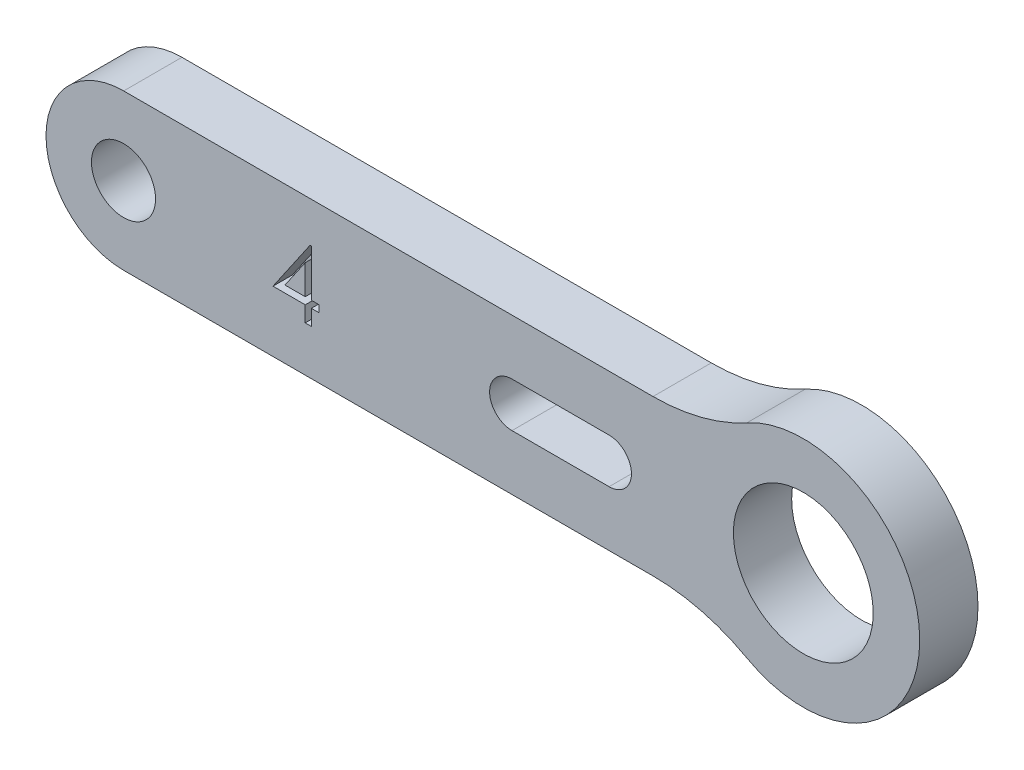
ISO-10303-21;
HEADER;
FILE_DESCRIPTION(('STEP AP214'),'2;1');
FILE_NAME('part.step','',(''),(''),'','','');
FILE_SCHEMA(('AUTOMOTIVE_DESIGN { 1 0 10303 214 1 1 1 1 }'));
ENDSEC;
DATA;
#1=APPLICATION_CONTEXT('core data for automotive mechanical design processes');
#2=APPLICATION_PROTOCOL_DEFINITION('international standard','automotive_design',2000,#1);
#3=PRODUCT_CONTEXT('',#1,'mechanical');
#4=PRODUCT('Part','Part','',(#3));
#5=PRODUCT_RELATED_PRODUCT_CATEGORY('part','',(#4));
#6=PRODUCT_DEFINITION_FORMATION('','',#4);
#7=PRODUCT_DEFINITION_CONTEXT('part definition',#1,'design');
#8=PRODUCT_DEFINITION('design','',#6,#7);
#9=PRODUCT_DEFINITION_SHAPE('','',#8);
#10=(LENGTH_UNIT() NAMED_UNIT(*) SI_UNIT(.MILLI.,.METRE.));
#11=(NAMED_UNIT(*) PLANE_ANGLE_UNIT() SI_UNIT($,.RADIAN.));
#12=(NAMED_UNIT(*) SI_UNIT($,.STERADIAN.) SOLID_ANGLE_UNIT());
#13=UNCERTAINTY_MEASURE_WITH_UNIT(LENGTH_MEASURE(1.E-05),#10,'distance_accuracy_value','');
#14=(GEOMETRIC_REPRESENTATION_CONTEXT(3) GLOBAL_UNCERTAINTY_ASSIGNED_CONTEXT((#13)) GLOBAL_UNIT_ASSIGNED_CONTEXT((#10,
#11,#12)) REPRESENTATION_CONTEXT('',''));
#15=CARTESIAN_POINT('',(0.,0.,0.));
#16=DIRECTION('',(0.,0.,1.));
#17=DIRECTION('',(1.,0.,0.));
#18=AXIS2_PLACEMENT_3D('',#15,#16,#17);
#19=CARTESIAN_POINT('',(23.3783422515076,4.00149259352111,3.));
#20=DIRECTION('',(0.,0.,1.));
#21=DIRECTION('',(1.,0.,0.));
#22=AXIS2_PLACEMENT_3D('',#19,#20,#21);
#23=PLANE('',#22);
#24=CARTESIAN_POINT('',(23.3783422515076,4.00149259352111,3.));
#25=DIRECTION('',(0.,0.,1.));
#26=DIRECTION('',(1.,0.,0.));
#27=AXIS2_PLACEMENT_3D('',#24,#25,#26);
#28=CIRCLE('',#27,5.99460570350379);
#29=CARTESIAN_POINT('',(20.4804285975604,-1.24611581362462,3.));
#30=VERTEX_POINT('',#29);
#31=CARTESIAN_POINT('',(20.4784035436222,9.24798218476098,3.));
#32=VERTEX_POINT('',#31);
#33=EDGE_CURVE('E340',#30,#32,#28,.T.);
#34=ORIENTED_EDGE('',*,*,#33,.T.);
#35=CARTESIAN_POINT('',(15.6408231399763,18.,3.));
#36=DIRECTION('',(0.,0.,-1.));
#37=DIRECTION('',(-1.,0.,0.));
#38=AXIS2_PLACEMENT_3D('',#35,#36,#37);
#39=CIRCLE('',#38,10.);
#40=CARTESIAN_POINT('',(15.6408231399763,8.,3.));
#41=VERTEX_POINT('',#40);
#42=EDGE_CURVE('E364',#32,#41,#39,.T.);
#43=ORIENTED_EDGE('',*,*,#42,.T.);
#44=DIRECTION('',(-1.,0.,0.));
#45=VECTOR('',#44,1.);
#46=CARTESIAN_POINT('',(15.6408231399763,8.,3.));
#47=LINE('',#46,#45);
#48=CARTESIAN_POINT('',(-11.6110208815812,8.,3.));
#49=VERTEX_POINT('',#48);
#50=EDGE_CURVE('E367',#41,#49,#47,.T.);
#51=ORIENTED_EDGE('',*,*,#50,.T.);
#52=CARTESIAN_POINT('',(-11.6110208815812,4.,3.));
#53=DIRECTION('',(0.,0.,1.));
#54=DIRECTION('',(1.,0.,0.));
#55=AXIS2_PLACEMENT_3D('',#52,#53,#54);
#56=CIRCLE('',#55,4.);
#57=CARTESIAN_POINT('',(-11.6110208815812,0.,3.));
#58=VERTEX_POINT('',#57);
#59=EDGE_CURVE('E370',#49,#58,#56,.T.);
#60=ORIENTED_EDGE('',*,*,#59,.T.);
#61=DIRECTION('',(1.,0.,0.));
#62=VECTOR('',#61,1.);
#63=CARTESIAN_POINT('',(-11.6110208815812,0.,3.));
#64=LINE('',#63,#62);
#65=CARTESIAN_POINT('',(15.6462263209147,0.,3.));
#66=VERTEX_POINT('',#65);
#67=EDGE_CURVE('E373',#58,#66,#64,.T.);
#68=ORIENTED_EDGE('',*,*,#67,.T.);
#69=CARTESIAN_POINT('',(15.6462263209147,-10.,3.));
#70=DIRECTION('',(0.,0.,-1.));
#71=DIRECTION('',(-1.,0.,0.));
#72=AXIS2_PLACEMENT_3D('',#69,#70,#71);
#73=CIRCLE('',#72,9.99999999999999);
#74=EDGE_CURVE('E347',#66,#30,#73,.T.);
#75=ORIENTED_EDGE('',*,*,#74,.T.);
#76=EDGE_LOOP('',(#34,#43,#51,#60,#68,#75));
#77=FACE_BOUND('',#76,.T.);
#78=CARTESIAN_POINT('',(-11.6193859771087,4.00018272906783,3.));
#79=DIRECTION('',(0.,0.,1.));
#80=DIRECTION('',(-1.,0.,0.));
#81=AXIS2_PLACEMENT_3D('',#78,#79,#80);
#82=CIRCLE('',#81,1.65);
#83=CARTESIAN_POINT('',(-13.2693859771087,4.00018272906783,3.));
#84=VERTEX_POINT('',#83);
#85=EDGE_CURVE('E334',#84,#84,#82,.T.);
#86=ORIENTED_EDGE('',*,*,#85,.F.);
#87=EDGE_LOOP('',(#86));
#88=FACE_BOUND('',#87,.T.);
#89=CARTESIAN_POINT('',(23.3793348450287,4.00050000000005,3.));
#90=DIRECTION('',(0.,0.,1.));
#91=DIRECTION('',(-1.,0.,0.));
#92=AXIS2_PLACEMENT_3D('',#89,#90,#91);
#93=CIRCLE('',#92,3.6);
#94=CARTESIAN_POINT('',(19.7793348450287,4.00050000000005,3.));
#95=VERTEX_POINT('',#94);
#96=EDGE_CURVE('E324',#95,#95,#93,.T.);
#97=ORIENTED_EDGE('',*,*,#96,.F.);
#98=EDGE_LOOP('',(#97));
#99=FACE_BOUND('',#98,.T.);
#100=CARTESIAN_POINT('',(13.3803806473393,4.00026662444805,3.));
#101=DIRECTION('',(0.,0.,1.));
#102=DIRECTION('',(-1.,0.,0.));
#103=AXIS2_PLACEMENT_3D('',#100,#101,#102);
#104=CIRCLE('',#103,1.15);
#105=CARTESIAN_POINT('',(13.3803806473393,2.85026662444805,3.));
#106=VERTEX_POINT('',#105);
#107=CARTESIAN_POINT('',(13.3803806473393,5.15026662444805,3.));
#108=VERTEX_POINT('',#107);
#109=EDGE_CURVE('E298',#106,#108,#104,.T.);
#110=ORIENTED_EDGE('',*,*,#109,.F.);
#111=DIRECTION('',(1.,0.,0.));
#112=VECTOR('',#111,1.);
#113=CARTESIAN_POINT('',(13.3803806473393,2.85026662444805,3.));
#114=LINE('',#113,#112);
#115=CARTESIAN_POINT('',(8.37884739844319,2.85026662444805,3.));
#116=VERTEX_POINT('',#115);
#117=EDGE_CURVE('E303',#116,#106,#114,.T.);
#118=ORIENTED_EDGE('',*,*,#117,.F.);
#119=CARTESIAN_POINT('',(8.37884739844319,4.00026662444805,3.));
#120=DIRECTION('',(0.,0.,1.));
#121=DIRECTION('',(-1.,0.,0.));
#122=AXIS2_PLACEMENT_3D('',#119,#120,#121);
#123=CIRCLE('',#122,1.15);
#124=CARTESIAN_POINT('',(8.37884739844319,5.15026662444805,3.));
#125=VERTEX_POINT('',#124);
#126=EDGE_CURVE('E317',#125,#116,#123,.T.);
#127=ORIENTED_EDGE('',*,*,#126,.F.);
#128=DIRECTION('',(-1.,0.,0.));
#129=VECTOR('',#128,1.);
#130=CARTESIAN_POINT('',(8.37884739844319,5.15026662444805,3.));
#131=LINE('',#130,#129);
#132=EDGE_CURVE('E314',#108,#125,#131,.T.);
#133=ORIENTED_EDGE('',*,*,#132,.F.);
#134=EDGE_LOOP('',(#110,#118,#127,#133));
#135=FACE_BOUND('',#134,.T.);
#136=DIRECTION('',(-1.,0.,0.));
#137=VECTOR('',#136,1.);
#138=CARTESIAN_POINT('',(-2.26451970623572,3.13759778998194,3.));
#139=LINE('',#138,#137);
#140=CARTESIAN_POINT('',(-2.26451970623572,3.13759778998194,3.));
#141=VERTEX_POINT('',#140);
#142=CARTESIAN_POINT('',(-3.92477611649213,3.13759778998194,3.));
#143=VERTEX_POINT('',#142);
#144=EDGE_CURVE('E233',#141,#143,#139,.T.);
#145=ORIENTED_EDGE('',*,*,#144,.T.);
#146=DIRECTION('',(0.566105543193208,0.824332768950697,0.));
#147=VECTOR('',#146,1.);
#148=CARTESIAN_POINT('',(-3.92477611649213,3.13759778998194,3.));
#149=LINE('',#148,#147);
#150=CARTESIAN_POINT('',(-2.01421922546649,5.91964907203322,3.));
#151=VERTEX_POINT('',#150);
#152=EDGE_CURVE('E56',#143,#151,#149,.T.);
#153=ORIENTED_EDGE('',*,*,#152,.T.);
#154=DIRECTION('',(1.,0.,0.));
#155=VECTOR('',#154,1.);
#156=CARTESIAN_POINT('',(-2.01421922546649,5.91964907203322,3.));
#157=LINE('',#156,#155);
#158=CARTESIAN_POINT('',(-1.95041714213315,5.91964907203322,3.));
#159=VERTEX_POINT('',#158);
#160=EDGE_CURVE('E253',#151,#159,#157,.T.);
#161=ORIENTED_EDGE('',*,*,#160,.T.);
#162=DIRECTION('',(0.,-1.,0.));
#163=VECTOR('',#162,1.);
#164=CARTESIAN_POINT('',(-1.95041714213315,5.91964907203322,3.));
#165=LINE('',#164,#163);
#166=CARTESIAN_POINT('',(-1.95041714213315,3.49657214895629,3.));
#167=VERTEX_POINT('',#166);
#168=EDGE_CURVE('E256',#159,#167,#165,.T.);
#169=ORIENTED_EDGE('',*,*,#168,.T.);
#170=DIRECTION('',(1.,0.,0.));
#171=VECTOR('',#170,1.);
#172=CARTESIAN_POINT('',(-1.95041714213315,3.49657214895629,3.));
#173=LINE('',#172,#171);
#174=CARTESIAN_POINT('',(-1.546570988287,3.49657214895629,3.));
#175=VERTEX_POINT('',#174);
#176=EDGE_CURVE('E259',#167,#175,#173,.T.);
#177=ORIENTED_EDGE('',*,*,#176,.T.);
#178=DIRECTION('',(0.,-1.,0.));
#179=VECTOR('',#178,1.);
#180=CARTESIAN_POINT('',(-1.546570988287,3.49657214895629,3.));
#181=LINE('',#180,#179);
#182=CARTESIAN_POINT('',(-1.546570988287,3.13759778998194,3.));
#183=VERTEX_POINT('',#182);
#184=EDGE_CURVE('E262',#175,#183,#181,.T.);
#185=ORIENTED_EDGE('',*,*,#184,.T.);
#186=DIRECTION('',(-1.,0.,0.));
#187=VECTOR('',#186,1.);
#188=CARTESIAN_POINT('',(-1.546570988287,3.13759778998194,3.));
#189=LINE('',#188,#187);
#190=CARTESIAN_POINT('',(-1.95041714213315,3.13759778998194,3.));
#191=VERTEX_POINT('',#190);
#192=EDGE_CURVE('E265',#183,#191,#189,.T.);
#193=ORIENTED_EDGE('',*,*,#192,.T.);
#194=DIRECTION('',(0.,-1.,0.));
#195=VECTOR('',#194,1.);
#196=CARTESIAN_POINT('',(-1.95041714213315,3.13759778998194,3.));
#197=LINE('',#196,#195);
#198=CARTESIAN_POINT('',(-1.95041714213315,2.32990548228963,3.));
#199=VERTEX_POINT('',#198);
#200=EDGE_CURVE('E268',#191,#199,#197,.T.);
#201=ORIENTED_EDGE('',*,*,#200,.T.);
#202=DIRECTION('',(-1.,0.,0.));
#203=VECTOR('',#202,1.);
#204=CARTESIAN_POINT('',(-1.95041714213315,2.32990548228963,3.));
#205=LINE('',#204,#203);
#206=CARTESIAN_POINT('',(-2.26451970623572,2.32990548228963,3.));
#207=VERTEX_POINT('',#206);
#208=EDGE_CURVE('E271',#199,#207,#205,.T.);
#209=ORIENTED_EDGE('',*,*,#208,.T.);
#210=DIRECTION('',(0.,1.,0.));
#211=VECTOR('',#210,1.);
#212=CARTESIAN_POINT('',(-2.26451970623572,2.32990548228963,3.));
#213=LINE('',#212,#211);
#214=EDGE_CURVE('E274',#207,#141,#213,.T.);
#215=ORIENTED_EDGE('',*,*,#214,.T.);
#216=EDGE_LOOP('',(#145,#153,#161,#169,#177,#185,#193,#201,#209,#215));
#217=FACE_BOUND('',#216,.T.);
#218=ADVANCED_FACE('F39',(#77,#88,#99,#135,#217),#23,.T.);
#219=CARTESIAN_POINT('',(23.3783422515076,4.00149259352111,0.));
#220=DIRECTION('',(0.,0.,1.));
#221=DIRECTION('',(1.,0.,0.));
#222=AXIS2_PLACEMENT_3D('',#219,#220,#221);
#223=CYLINDRICAL_SURFACE('',#222,5.99460570350379);
#224=ORIENTED_EDGE('',*,*,#33,.F.);
#225=DIRECTION('',(0.,0.,1.));
#226=VECTOR('',#225,1.);
#227=CARTESIAN_POINT('',(20.4804285975604,-1.24611581362462,0.));
#228=LINE('',#227,#226);
#229=CARTESIAN_POINT('',(20.4804285975604,-1.24611581362462,0.));
#230=VERTEX_POINT('',#229);
#231=EDGE_CURVE('E11',#230,#30,#228,.T.);
#232=ORIENTED_EDGE('',*,*,#231,.F.);
#233=CARTESIAN_POINT('',(23.3783422515076,4.00149259352111,0.));
#234=DIRECTION('',(0.,0.,1.));
#235=DIRECTION('',(1.,0.,0.));
#236=AXIS2_PLACEMENT_3D('',#233,#234,#235);
#237=CIRCLE('',#236,5.99460570350379);
#238=CARTESIAN_POINT('',(20.4784035436222,9.24798218476098,0.));
#239=VERTEX_POINT('',#238);
#240=EDGE_CURVE('E343',#230,#239,#237,.T.);
#241=ORIENTED_EDGE('',*,*,#240,.T.);
#242=DIRECTION('',(0.,0.,1.));
#243=VECTOR('',#242,1.);
#244=CARTESIAN_POINT('',(20.4784035436222,9.24798218476098,0.));
#245=LINE('',#244,#243);
#246=EDGE_CURVE('E43',#239,#32,#245,.T.);
#247=ORIENTED_EDGE('',*,*,#246,.T.);
#248=EDGE_LOOP('',(#224,#232,#241,#247));
#249=FACE_BOUND('',#248,.T.);
#250=ADVANCED_FACE('F41',(#249),#223,.T.);
#251=CARTESIAN_POINT('',(15.6462263209147,-10.,0.));
#252=DIRECTION('',(0.,0.,1.));
#253=DIRECTION('',(1.,0.,0.));
#254=AXIS2_PLACEMENT_3D('',#251,#252,#253);
#255=CYLINDRICAL_SURFACE('',#254,9.99999999999999);
#256=ORIENTED_EDGE('',*,*,#74,.F.);
#257=DIRECTION('',(0.,0.,1.));
#258=VECTOR('',#257,1.);
#259=CARTESIAN_POINT('',(15.6462263209147,0.,0.));
#260=LINE('',#259,#258);
#261=CARTESIAN_POINT('',(15.6462263209147,0.,0.));
#262=VERTEX_POINT('',#261);
#263=EDGE_CURVE('E48',#262,#66,#260,.T.);
#264=ORIENTED_EDGE('',*,*,#263,.F.);
#265=CARTESIAN_POINT('',(15.6462263209147,-10.,0.));
#266=DIRECTION('',(0.,0.,-1.));
#267=DIRECTION('',(-1.,0.,0.));
#268=AXIS2_PLACEMENT_3D('',#265,#266,#267);
#269=CIRCLE('',#268,9.99999999999999);
#270=EDGE_CURVE('E359',#262,#230,#269,.T.);
#271=ORIENTED_EDGE('',*,*,#270,.T.);
#272=ORIENTED_EDGE('',*,*,#231,.T.);
#273=EDGE_LOOP('',(#256,#264,#271,#272));
#274=FACE_BOUND('',#273,.T.);
#275=ADVANCED_FACE('F396',(#274),#255,.F.);
#276=CARTESIAN_POINT('',(-11.6110208815812,0.,0.));
#277=DIRECTION('',(0.,-1.,0.));
#278=DIRECTION('',(0.,0.,-1.));
#279=AXIS2_PLACEMENT_3D('',#276,#277,#278);
#280=PLANE('',#279);
#281=ORIENTED_EDGE('',*,*,#67,.F.);
#282=DIRECTION('',(0.,0.,1.));
#283=VECTOR('',#282,1.);
#284=CARTESIAN_POINT('',(-11.6110208815812,0.,0.));
#285=LINE('',#284,#283);
#286=CARTESIAN_POINT('',(-11.6110208815812,0.,0.));
#287=VERTEX_POINT('',#286);
#288=EDGE_CURVE('E379',#287,#58,#285,.T.);
#289=ORIENTED_EDGE('',*,*,#288,.F.);
#290=DIRECTION('',(1.,0.,0.));
#291=VECTOR('',#290,1.);
#292=CARTESIAN_POINT('',(-11.6110208815812,0.,0.));
#293=LINE('',#292,#291);
#294=EDGE_CURVE('E356',#287,#262,#293,.T.);
#295=ORIENTED_EDGE('',*,*,#294,.T.);
#296=ORIENTED_EDGE('',*,*,#263,.T.);
#297=EDGE_LOOP('',(#281,#289,#295,#296));
#298=FACE_BOUND('',#297,.T.);
#299=ADVANCED_FACE('F409',(#298),#280,.T.);
#300=CARTESIAN_POINT('',(-11.6110208815812,4.,0.));
#301=DIRECTION('',(0.,0.,1.));
#302=DIRECTION('',(1.,0.,0.));
#303=AXIS2_PLACEMENT_3D('',#300,#301,#302);
#304=CYLINDRICAL_SURFACE('',#303,4.);
#305=ORIENTED_EDGE('',*,*,#59,.F.);
#306=DIRECTION('',(0.,0.,1.));
#307=VECTOR('',#306,1.);
#308=CARTESIAN_POINT('',(-11.6110208815812,8.,0.));
#309=LINE('',#308,#307);
#310=CARTESIAN_POINT('',(-11.6110208815812,8.,0.));
#311=VERTEX_POINT('',#310);
#312=EDGE_CURVE('E381',#311,#49,#309,.T.);
#313=ORIENTED_EDGE('',*,*,#312,.F.);
#314=CARTESIAN_POINT('',(-11.6110208815812,4.,0.));
#315=DIRECTION('',(0.,0.,1.));
#316=DIRECTION('',(1.,0.,0.));
#317=AXIS2_PLACEMENT_3D('',#314,#315,#316);
#318=CIRCLE('',#317,4.);
#319=EDGE_CURVE('E353',#311,#287,#318,.T.);
#320=ORIENTED_EDGE('',*,*,#319,.T.);
#321=ORIENTED_EDGE('',*,*,#288,.T.);
#322=EDGE_LOOP('',(#305,#313,#320,#321));
#323=FACE_BOUND('',#322,.T.);
#324=ADVANCED_FACE('F407',(#323),#304,.T.);
#325=CARTESIAN_POINT('',(15.6408231399763,8.,0.));
#326=DIRECTION('',(0.,1.,0.));
#327=DIRECTION('',(0.,0.,1.));
#328=AXIS2_PLACEMENT_3D('',#325,#326,#327);
#329=PLANE('',#328);
#330=ORIENTED_EDGE('',*,*,#50,.F.);
#331=DIRECTION('',(0.,0.,1.));
#332=VECTOR('',#331,1.);
#333=CARTESIAN_POINT('',(15.6408231399763,8.,0.));
#334=LINE('',#333,#332);
#335=CARTESIAN_POINT('',(15.6408231399763,8.,0.));
#336=VERTEX_POINT('',#335);
#337=EDGE_CURVE('E382',#336,#41,#334,.T.);
#338=ORIENTED_EDGE('',*,*,#337,.F.);
#339=DIRECTION('',(-1.,0.,0.));
#340=VECTOR('',#339,1.);
#341=CARTESIAN_POINT('',(15.6408231399763,8.,0.));
#342=LINE('',#341,#340);
#343=EDGE_CURVE('E350',#336,#311,#342,.T.);
#344=ORIENTED_EDGE('',*,*,#343,.T.);
#345=ORIENTED_EDGE('',*,*,#312,.T.);
#346=EDGE_LOOP('',(#330,#338,#344,#345));
#347=FACE_BOUND('',#346,.T.);
#348=ADVANCED_FACE('F404',(#347),#329,.T.);
#349=CARTESIAN_POINT('',(15.6408231399763,18.,0.));
#350=DIRECTION('',(0.,0.,1.));
#351=DIRECTION('',(1.,0.,0.));
#352=AXIS2_PLACEMENT_3D('',#349,#350,#351);
#353=CYLINDRICAL_SURFACE('',#352,10.);
#354=ORIENTED_EDGE('',*,*,#42,.F.);
#355=ORIENTED_EDGE('',*,*,#246,.F.);
#356=CARTESIAN_POINT('',(15.6408231399763,18.,0.));
#357=DIRECTION('',(0.,0.,-1.));
#358=DIRECTION('',(-1.,0.,0.));
#359=AXIS2_PLACEMENT_3D('',#356,#357,#358);
#360=CIRCLE('',#359,10.);
#361=EDGE_CURVE('E346',#239,#336,#360,.T.);
#362=ORIENTED_EDGE('',*,*,#361,.T.);
#363=ORIENTED_EDGE('',*,*,#337,.T.);
#364=EDGE_LOOP('',(#354,#355,#362,#363));
#365=FACE_BOUND('',#364,.T.);
#366=ADVANCED_FACE('F390',(#365),#353,.F.);
#367=CARTESIAN_POINT('',(23.3783422515076,4.00149259352111,0.));
#368=DIRECTION('',(0.,0.,1.));
#369=DIRECTION('',(1.,0.,0.));
#370=AXIS2_PLACEMENT_3D('',#367,#368,#369);
#371=PLANE('',#370);
#372=DIRECTION('',(1.,0.,0.));
#373=VECTOR('',#372,1.);
#374=CARTESIAN_POINT('',(13.3803806473393,2.85026662444805,0.));
#375=LINE('',#374,#373);
#376=CARTESIAN_POINT('',(8.37884739844319,2.85026662444805,0.));
#377=VERTEX_POINT('',#376);
#378=CARTESIAN_POINT('',(13.3803806473393,2.85026662444805,0.));
#379=VERTEX_POINT('',#378);
#380=EDGE_CURVE('E309',#377,#379,#375,.T.);
#381=ORIENTED_EDGE('',*,*,#380,.T.);
#382=CARTESIAN_POINT('',(13.3803806473393,4.00026662444805,0.));
#383=DIRECTION('',(0.,0.,1.));
#384=DIRECTION('',(-1.,0.,0.));
#385=AXIS2_PLACEMENT_3D('',#382,#383,#384);
#386=CIRCLE('',#385,1.15);
#387=CARTESIAN_POINT('',(13.3803806473393,5.15026662444805,0.));
#388=VERTEX_POINT('',#387);
#389=EDGE_CURVE('E299',#379,#388,#386,.T.);
#390=ORIENTED_EDGE('',*,*,#389,.T.);
#391=DIRECTION('',(-1.,0.,0.));
#392=VECTOR('',#391,1.);
#393=CARTESIAN_POINT('',(8.37884739844319,5.15026662444805,0.));
#394=LINE('',#393,#392);
#395=CARTESIAN_POINT('',(8.37884739844319,5.15026662444805,0.));
#396=VERTEX_POINT('',#395);
#397=EDGE_CURVE('E302',#388,#396,#394,.T.);
#398=ORIENTED_EDGE('',*,*,#397,.T.);
#399=CARTESIAN_POINT('',(8.37884739844319,4.00026662444805,0.));
#400=DIRECTION('',(0.,0.,1.));
#401=DIRECTION('',(-1.,0.,0.));
#402=AXIS2_PLACEMENT_3D('',#399,#400,#401);
#403=CIRCLE('',#402,1.15);
#404=EDGE_CURVE('E306',#396,#377,#403,.T.);
#405=ORIENTED_EDGE('',*,*,#404,.T.);
#406=EDGE_LOOP('',(#381,#390,#398,#405));
#407=FACE_BOUND('',#406,.T.);
#408=CARTESIAN_POINT('',(23.3793348450287,4.00050000000005,0.));
#409=DIRECTION('',(0.,0.,1.));
#410=DIRECTION('',(-1.,0.,0.));
#411=AXIS2_PLACEMENT_3D('',#408,#409,#410);
#412=CIRCLE('',#411,3.6);
#413=CARTESIAN_POINT('',(19.7793348450287,4.00050000000005,0.));
#414=VERTEX_POINT('',#413);
#415=EDGE_CURVE('E331',#414,#414,#412,.T.);
#416=ORIENTED_EDGE('',*,*,#415,.T.);
#417=EDGE_LOOP('',(#416));
#418=FACE_BOUND('',#417,.T.);
#419=CARTESIAN_POINT('',(-11.6193859771087,4.00018272906783,0.));
#420=DIRECTION('',(0.,0.,1.));
#421=DIRECTION('',(-1.,0.,0.));
#422=AXIS2_PLACEMENT_3D('',#419,#420,#421);
#423=CIRCLE('',#422,1.65);
#424=CARTESIAN_POINT('',(-13.2693859771087,4.00018272906783,0.));
#425=VERTEX_POINT('',#424);
#426=EDGE_CURVE('E337',#425,#425,#423,.T.);
#427=ORIENTED_EDGE('',*,*,#426,.T.);
#428=EDGE_LOOP('',(#427));
#429=FACE_BOUND('',#428,.T.);
#430=ORIENTED_EDGE('',*,*,#240,.F.);
#431=ORIENTED_EDGE('',*,*,#270,.F.);
#432=ORIENTED_EDGE('',*,*,#294,.F.);
#433=ORIENTED_EDGE('',*,*,#319,.F.);
#434=ORIENTED_EDGE('',*,*,#343,.F.);
#435=ORIENTED_EDGE('',*,*,#361,.F.);
#436=EDGE_LOOP('',(#430,#431,#432,#433,#434,#435));
#437=FACE_BOUND('',#436,.T.);
#438=ADVANCED_FACE('F399',(#407,#418,#429,#437),#371,.F.);
#439=CARTESIAN_POINT('',(-11.6193859771087,4.00018272906783,0.));
#440=DIRECTION('',(0.,0.,1.));
#441=DIRECTION('',(1.,0.,0.));
#442=AXIS2_PLACEMENT_3D('',#439,#440,#441);
#443=CYLINDRICAL_SURFACE('',#442,1.65);
#444=ORIENTED_EDGE('',*,*,#426,.F.);
#445=EDGE_LOOP('',(#444));
#446=FACE_BOUND('',#445,.T.);
#447=ORIENTED_EDGE('',*,*,#85,.T.);
#448=EDGE_LOOP('',(#447));
#449=FACE_BOUND('',#448,.T.);
#450=ADVANCED_FACE('F499',(#446,#449),#443,.F.);
#451=CARTESIAN_POINT('',(23.3793348450287,4.00050000000005,0.));
#452=DIRECTION('',(0.,0.,1.));
#453=DIRECTION('',(1.,0.,0.));
#454=AXIS2_PLACEMENT_3D('',#451,#452,#453);
#455=CYLINDRICAL_SURFACE('',#454,3.6);
#456=ORIENTED_EDGE('',*,*,#415,.F.);
#457=EDGE_LOOP('',(#456));
#458=FACE_BOUND('',#457,.T.);
#459=ORIENTED_EDGE('',*,*,#96,.T.);
#460=EDGE_LOOP('',(#459));
#461=FACE_BOUND('',#460,.T.);
#462=ADVANCED_FACE('F495',(#458,#461),#455,.F.);
#463=CARTESIAN_POINT('',(13.3803806473393,4.00026662444805,0.));
#464=DIRECTION('',(0.,0.,1.));
#465=DIRECTION('',(1.,0.,0.));
#466=AXIS2_PLACEMENT_3D('',#463,#464,#465);
#467=CYLINDRICAL_SURFACE('',#466,1.15);
#468=ORIENTED_EDGE('',*,*,#109,.T.);
#469=DIRECTION('',(0.,0.,1.));
#470=VECTOR('',#469,1.);
#471=CARTESIAN_POINT('',(13.3803806473393,5.15026662444805,0.));
#472=LINE('',#471,#470);
#473=EDGE_CURVE('E312',#388,#108,#472,.T.);
#474=ORIENTED_EDGE('',*,*,#473,.F.);
#475=ORIENTED_EDGE('',*,*,#389,.F.);
#476=DIRECTION('',(0.,0.,1.));
#477=VECTOR('',#476,1.);
#478=CARTESIAN_POINT('',(13.3803806473393,2.85026662444805,0.));
#479=LINE('',#478,#477);
#480=EDGE_CURVE('E322',#379,#106,#479,.T.);
#481=ORIENTED_EDGE('',*,*,#480,.T.);
#482=EDGE_LOOP('',(#468,#474,#475,#481));
#483=FACE_BOUND('',#482,.T.);
#484=ADVANCED_FACE('F486',(#483),#467,.F.);
#485=CARTESIAN_POINT('',(13.3803806473393,2.85026662444805,0.));
#486=DIRECTION('',(0.,-1.,0.));
#487=DIRECTION('',(0.,0.,-1.));
#488=AXIS2_PLACEMENT_3D('',#485,#486,#487);
#489=PLANE('',#488);
#490=ORIENTED_EDGE('',*,*,#117,.T.);
#491=ORIENTED_EDGE('',*,*,#480,.F.);
#492=ORIENTED_EDGE('',*,*,#380,.F.);
#493=DIRECTION('',(0.,0.,1.));
#494=VECTOR('',#493,1.);
#495=CARTESIAN_POINT('',(8.37884739844319,2.85026662444805,0.));
#496=LINE('',#495,#494);
#497=EDGE_CURVE('E325',#377,#116,#496,.T.);
#498=ORIENTED_EDGE('',*,*,#497,.T.);
#499=EDGE_LOOP('',(#490,#491,#492,#498));
#500=FACE_BOUND('',#499,.T.);
#501=ADVANCED_FACE('F482',(#500),#489,.F.);
#502=CARTESIAN_POINT('',(8.37884739844319,4.00026662444805,0.));
#503=DIRECTION('',(0.,0.,1.));
#504=DIRECTION('',(1.,0.,0.));
#505=AXIS2_PLACEMENT_3D('',#502,#503,#504);
#506=CYLINDRICAL_SURFACE('',#505,1.15);
#507=ORIENTED_EDGE('',*,*,#126,.T.);
#508=ORIENTED_EDGE('',*,*,#497,.F.);
#509=ORIENTED_EDGE('',*,*,#404,.F.);
#510=DIRECTION('',(0.,0.,1.));
#511=VECTOR('',#510,1.);
#512=CARTESIAN_POINT('',(8.37884739844319,5.15026662444805,0.));
#513=LINE('',#512,#511);
#514=EDGE_CURVE('E327',#396,#125,#513,.T.);
#515=ORIENTED_EDGE('',*,*,#514,.T.);
#516=EDGE_LOOP('',(#507,#508,#509,#515));
#517=FACE_BOUND('',#516,.T.);
#518=ADVANCED_FACE('F485',(#517),#506,.F.);
#519=CARTESIAN_POINT('',(8.37884739844319,5.15026662444805,0.));
#520=DIRECTION('',(0.,1.,0.));
#521=DIRECTION('',(0.,0.,1.));
#522=AXIS2_PLACEMENT_3D('',#519,#520,#521);
#523=PLANE('',#522);
#524=ORIENTED_EDGE('',*,*,#132,.T.);
#525=ORIENTED_EDGE('',*,*,#514,.F.);
#526=ORIENTED_EDGE('',*,*,#397,.F.);
#527=ORIENTED_EDGE('',*,*,#473,.T.);
#528=EDGE_LOOP('',(#524,#525,#526,#527));
#529=FACE_BOUND('',#528,.T.);
#530=ADVANCED_FACE('F481',(#529),#523,.F.);
#531=CARTESIAN_POINT('',(-3.92477611649213,3.13759778998194,2.));
#532=DIRECTION('',(0.824332768950697,-0.566105543193208,0.));
#533=DIRECTION('',(0.566105543193208,0.824332768950697,0.));
#534=AXIS2_PLACEMENT_3D('',#531,#532,#533);
#535=PLANE('',#534);
#536=ORIENTED_EDGE('',*,*,#152,.F.);
#537=DIRECTION('',(0.,0.,1.));
#538=VECTOR('',#537,1.);
#539=CARTESIAN_POINT('',(-3.92477611649213,3.13759778998194,2.));
#540=LINE('',#539,#538);
#541=CARTESIAN_POINT('',(-3.92477611649213,3.13759778998194,2.));
#542=VERTEX_POINT('',#541);
#543=EDGE_CURVE('E251',#542,#143,#540,.T.);
#544=ORIENTED_EDGE('',*,*,#543,.F.);
#545=DIRECTION('',(0.566105543193208,0.824332768950697,0.));
#546=VECTOR('',#545,1.);
#547=CARTESIAN_POINT('',(-3.92477611649213,3.13759778998194,2.));
#548=LINE('',#547,#546);
#549=CARTESIAN_POINT('',(-2.01421922546649,5.91964907203322,2.));
#550=VERTEX_POINT('',#549);
#551=EDGE_CURVE('E229',#542,#550,#548,.T.);
#552=ORIENTED_EDGE('',*,*,#551,.T.);
#553=DIRECTION('',(0.,0.,1.));
#554=VECTOR('',#553,1.);
#555=CARTESIAN_POINT('',(-2.01421922546649,5.91964907203322,2.));
#556=LINE('',#555,#554);
#557=EDGE_CURVE('E296',#550,#151,#556,.T.);
#558=ORIENTED_EDGE('',*,*,#557,.T.);
#559=EDGE_LOOP('',(#536,#544,#552,#558));
#560=FACE_BOUND('',#559,.T.);
#561=ADVANCED_FACE('F478',(#560),#535,.T.);
#562=CARTESIAN_POINT('',(-2.01421922546649,5.91964907203322,2.));
#563=DIRECTION('',(0.,-1.,0.));
#564=DIRECTION('',(0.,0.,-1.));
#565=AXIS2_PLACEMENT_3D('',#562,#563,#564);
#566=PLANE('',#565);
#567=ORIENTED_EDGE('',*,*,#160,.F.);
#568=ORIENTED_EDGE('',*,*,#557,.F.);
#569=DIRECTION('',(1.,0.,0.));
#570=VECTOR('',#569,1.);
#571=CARTESIAN_POINT('',(-2.01421922546649,5.91964907203322,2.));
#572=LINE('',#571,#570);
#573=CARTESIAN_POINT('',(-1.95041714213315,5.91964907203322,2.));
#574=VERTEX_POINT('',#573);
#575=EDGE_CURVE('E232',#550,#574,#572,.T.);
#576=ORIENTED_EDGE('',*,*,#575,.T.);
#577=DIRECTION('',(0.,0.,1.));
#578=VECTOR('',#577,1.);
#579=CARTESIAN_POINT('',(-1.95041714213315,5.91964907203322,2.));
#580=LINE('',#579,#578);
#581=EDGE_CURVE('E294',#574,#159,#580,.T.);
#582=ORIENTED_EDGE('',*,*,#581,.T.);
#583=EDGE_LOOP('',(#567,#568,#576,#582));
#584=FACE_BOUND('',#583,.T.);
#585=ADVANCED_FACE('F474',(#584),#566,.T.);
#586=CARTESIAN_POINT('',(-1.95041714213315,5.91964907203322,2.));
#587=DIRECTION('',(-1.,0.,0.));
#588=DIRECTION('',(0.,0.,1.));
#589=AXIS2_PLACEMENT_3D('',#586,#587,#588);
#590=PLANE('',#589);
#591=ORIENTED_EDGE('',*,*,#168,.F.);
#592=ORIENTED_EDGE('',*,*,#581,.F.);
#593=DIRECTION('',(0.,-1.,0.));
#594=VECTOR('',#593,1.);
#595=CARTESIAN_POINT('',(-1.95041714213315,5.91964907203322,2.));
#596=LINE('',#595,#594);
#597=CARTESIAN_POINT('',(-1.95041714213315,3.49657214895629,2.));
#598=VERTEX_POINT('',#597);
#599=EDGE_CURVE('E235',#574,#598,#596,.T.);
#600=ORIENTED_EDGE('',*,*,#599,.T.);
#601=DIRECTION('',(0.,0.,1.));
#602=VECTOR('',#601,1.);
#603=CARTESIAN_POINT('',(-1.95041714213315,3.49657214895629,2.));
#604=LINE('',#603,#602);
#605=EDGE_CURVE('E292',#598,#167,#604,.T.);
#606=ORIENTED_EDGE('',*,*,#605,.T.);
#607=EDGE_LOOP('',(#591,#592,#600,#606));
#608=FACE_BOUND('',#607,.T.);
#609=ADVANCED_FACE('F470',(#608),#590,.T.);
#610=CARTESIAN_POINT('',(-1.95041714213315,3.49657214895629,2.));
#611=DIRECTION('',(0.,-1.,0.));
#612=DIRECTION('',(0.,0.,-1.));
#613=AXIS2_PLACEMENT_3D('',#610,#611,#612);
#614=PLANE('',#613);
#615=ORIENTED_EDGE('',*,*,#176,.F.);
#616=ORIENTED_EDGE('',*,*,#605,.F.);
#617=DIRECTION('',(1.,0.,0.));
#618=VECTOR('',#617,1.);
#619=CARTESIAN_POINT('',(-1.95041714213315,3.49657214895629,2.));
#620=LINE('',#619,#618);
#621=CARTESIAN_POINT('',(-1.546570988287,3.49657214895629,2.));
#622=VERTEX_POINT('',#621);
#623=EDGE_CURVE('E237',#598,#622,#620,.T.);
#624=ORIENTED_EDGE('',*,*,#623,.T.);
#625=DIRECTION('',(0.,0.,1.));
#626=VECTOR('',#625,1.);
#627=CARTESIAN_POINT('',(-1.546570988287,3.49657214895629,2.));
#628=LINE('',#627,#626);
#629=EDGE_CURVE('E290',#622,#175,#628,.T.);
#630=ORIENTED_EDGE('',*,*,#629,.T.);
#631=EDGE_LOOP('',(#615,#616,#624,#630));
#632=FACE_BOUND('',#631,.T.);
#633=ADVANCED_FACE('F466',(#632),#614,.T.);
#634=CARTESIAN_POINT('',(-1.546570988287,3.49657214895629,2.));
#635=DIRECTION('',(-1.,0.,0.));
#636=DIRECTION('',(0.,0.,1.));
#637=AXIS2_PLACEMENT_3D('',#634,#635,#636);
#638=PLANE('',#637);
#639=ORIENTED_EDGE('',*,*,#184,.F.);
#640=ORIENTED_EDGE('',*,*,#629,.F.);
#641=DIRECTION('',(0.,-1.,0.));
#642=VECTOR('',#641,1.);
#643=CARTESIAN_POINT('',(-1.546570988287,3.49657214895629,2.));
#644=LINE('',#643,#642);
#645=CARTESIAN_POINT('',(-1.546570988287,3.13759778998194,2.));
#646=VERTEX_POINT('',#645);
#647=EDGE_CURVE('E239',#622,#646,#644,.T.);
#648=ORIENTED_EDGE('',*,*,#647,.T.);
#649=DIRECTION('',(0.,0.,1.));
#650=VECTOR('',#649,1.);
#651=CARTESIAN_POINT('',(-1.546570988287,3.13759778998194,2.));
#652=LINE('',#651,#650);
#653=EDGE_CURVE('E288',#646,#183,#652,.T.);
#654=ORIENTED_EDGE('',*,*,#653,.T.);
#655=EDGE_LOOP('',(#639,#640,#648,#654));
#656=FACE_BOUND('',#655,.T.);
#657=ADVANCED_FACE('F462',(#656),#638,.T.);
#658=CARTESIAN_POINT('',(-1.546570988287,3.13759778998194,2.));
#659=DIRECTION('',(0.,1.,0.));
#660=DIRECTION('',(0.,0.,1.));
#661=AXIS2_PLACEMENT_3D('',#658,#659,#660);
#662=PLANE('',#661);
#663=ORIENTED_EDGE('',*,*,#192,.F.);
#664=ORIENTED_EDGE('',*,*,#653,.F.);
#665=DIRECTION('',(-1.,0.,0.));
#666=VECTOR('',#665,1.);
#667=CARTESIAN_POINT('',(-1.546570988287,3.13759778998194,2.));
#668=LINE('',#667,#666);
#669=CARTESIAN_POINT('',(-1.95041714213315,3.13759778998194,2.));
#670=VERTEX_POINT('',#669);
#671=EDGE_CURVE('E241',#646,#670,#668,.T.);
#672=ORIENTED_EDGE('',*,*,#671,.T.);
#673=DIRECTION('',(0.,0.,1.));
#674=VECTOR('',#673,1.);
#675=CARTESIAN_POINT('',(-1.95041714213315,3.13759778998194,2.));
#676=LINE('',#675,#674);
#677=EDGE_CURVE('E286',#670,#191,#676,.T.);
#678=ORIENTED_EDGE('',*,*,#677,.T.);
#679=EDGE_LOOP('',(#663,#664,#672,#678));
#680=FACE_BOUND('',#679,.T.);
#681=ADVANCED_FACE('F458',(#680),#662,.T.);
#682=CARTESIAN_POINT('',(-1.95041714213315,3.13759778998194,2.));
#683=DIRECTION('',(-1.,0.,0.));
#684=DIRECTION('',(0.,0.,1.));
#685=AXIS2_PLACEMENT_3D('',#682,#683,#684);
#686=PLANE('',#685);
#687=ORIENTED_EDGE('',*,*,#200,.F.);
#688=ORIENTED_EDGE('',*,*,#677,.F.);
#689=DIRECTION('',(0.,-1.,0.));
#690=VECTOR('',#689,1.);
#691=CARTESIAN_POINT('',(-1.95041714213315,3.13759778998194,2.));
#692=LINE('',#691,#690);
#693=CARTESIAN_POINT('',(-1.95041714213315,2.32990548228963,2.));
#694=VERTEX_POINT('',#693);
#695=EDGE_CURVE('E243',#670,#694,#692,.T.);
#696=ORIENTED_EDGE('',*,*,#695,.T.);
#697=DIRECTION('',(0.,0.,1.));
#698=VECTOR('',#697,1.);
#699=CARTESIAN_POINT('',(-1.95041714213315,2.32990548228963,2.));
#700=LINE('',#699,#698);
#701=EDGE_CURVE('E284',#694,#199,#700,.T.);
#702=ORIENTED_EDGE('',*,*,#701,.T.);
#703=EDGE_LOOP('',(#687,#688,#696,#702));
#704=FACE_BOUND('',#703,.T.);
#705=ADVANCED_FACE('F454',(#704),#686,.T.);
#706=CARTESIAN_POINT('',(-1.95041714213315,2.32990548228963,2.));
#707=DIRECTION('',(0.,1.,0.));
#708=DIRECTION('',(0.,0.,1.));
#709=AXIS2_PLACEMENT_3D('',#706,#707,#708);
#710=PLANE('',#709);
#711=ORIENTED_EDGE('',*,*,#208,.F.);
#712=ORIENTED_EDGE('',*,*,#701,.F.);
#713=DIRECTION('',(-1.,0.,0.));
#714=VECTOR('',#713,1.);
#715=CARTESIAN_POINT('',(-1.95041714213315,2.32990548228963,2.));
#716=LINE('',#715,#714);
#717=CARTESIAN_POINT('',(-2.26451970623572,2.32990548228963,2.));
#718=VERTEX_POINT('',#717);
#719=EDGE_CURVE('E245',#694,#718,#716,.T.);
#720=ORIENTED_EDGE('',*,*,#719,.T.);
#721=DIRECTION('',(0.,0.,1.));
#722=VECTOR('',#721,1.);
#723=CARTESIAN_POINT('',(-2.26451970623572,2.32990548228963,2.));
#724=LINE('',#723,#722);
#725=EDGE_CURVE('E282',#718,#207,#724,.T.);
#726=ORIENTED_EDGE('',*,*,#725,.T.);
#727=EDGE_LOOP('',(#711,#712,#720,#726));
#728=FACE_BOUND('',#727,.T.);
#729=ADVANCED_FACE('F450',(#728),#710,.T.);
#730=CARTESIAN_POINT('',(-2.26451970623572,2.32990548228963,2.));
#731=DIRECTION('',(1.,0.,0.));
#732=DIRECTION('',(0.,0.,-1.));
#733=AXIS2_PLACEMENT_3D('',#730,#731,#732);
#734=PLANE('',#733);
#735=ORIENTED_EDGE('',*,*,#214,.F.);
#736=ORIENTED_EDGE('',*,*,#725,.F.);
#737=DIRECTION('',(0.,1.,0.));
#738=VECTOR('',#737,1.);
#739=CARTESIAN_POINT('',(-2.26451970623572,2.32990548228963,2.));
#740=LINE('',#739,#738);
#741=CARTESIAN_POINT('',(-2.26451970623572,3.13759778998194,2.));
#742=VERTEX_POINT('',#741);
#743=EDGE_CURVE('E247',#718,#742,#740,.T.);
#744=ORIENTED_EDGE('',*,*,#743,.T.);
#745=DIRECTION('',(0.,0.,1.));
#746=VECTOR('',#745,1.);
#747=CARTESIAN_POINT('',(-2.26451970623572,3.13759778998194,2.));
#748=LINE('',#747,#746);
#749=EDGE_CURVE('E280',#742,#141,#748,.T.);
#750=ORIENTED_EDGE('',*,*,#749,.T.);
#751=EDGE_LOOP('',(#735,#736,#744,#750));
#752=FACE_BOUND('',#751,.T.);
#753=ADVANCED_FACE('F446',(#752),#734,.T.);
#754=CARTESIAN_POINT('',(-2.26451970623572,3.13759778998194,2.));
#755=DIRECTION('',(0.,1.,0.));
#756=DIRECTION('',(0.,0.,1.));
#757=AXIS2_PLACEMENT_3D('',#754,#755,#756);
#758=PLANE('',#757);
#759=ORIENTED_EDGE('',*,*,#144,.F.);
#760=ORIENTED_EDGE('',*,*,#749,.F.);
#761=DIRECTION('',(-1.,0.,0.));
#762=VECTOR('',#761,1.);
#763=CARTESIAN_POINT('',(-2.26451970623572,3.13759778998194,2.));
#764=LINE('',#763,#762);
#765=EDGE_CURVE('E249',#742,#542,#764,.T.);
#766=ORIENTED_EDGE('',*,*,#765,.T.);
#767=ORIENTED_EDGE('',*,*,#543,.T.);
#768=EDGE_LOOP('',(#759,#760,#766,#767));
#769=FACE_BOUND('',#768,.T.);
#770=ADVANCED_FACE('F443',(#769),#758,.T.);
#771=CARTESIAN_POINT('',(0.,0.,2.));
#772=DIRECTION('',(0.,0.,-1.));
#773=DIRECTION('',(-1.,0.,0.));
#774=AXIS2_PLACEMENT_3D('',#771,#772,#773);
#775=PLANE('',#774);
#776=DIRECTION('',(1.,0.,0.));
#777=VECTOR('',#776,1.);
#778=CARTESIAN_POINT('',(-3.30778893700495,3.49657214895629,2.));
#779=LINE('',#778,#777);
#780=CARTESIAN_POINT('',(-3.30778893700495,3.49657214895629,2.));
#781=VERTEX_POINT('',#780);
#782=CARTESIAN_POINT('',(-2.26451970623572,3.49657214895629,2.));
#783=VERTEX_POINT('',#782);
#784=EDGE_CURVE('E215',#781,#783,#779,.T.);
#785=ORIENTED_EDGE('',*,*,#784,.F.);
#786=DIRECTION('',(-0.565883050718714,-0.82448552013318,0.));
#787=VECTOR('',#786,1.);
#788=CARTESIAN_POINT('',(-2.26451970623572,5.01660420023835,2.));
#789=LINE('',#788,#787);
#790=CARTESIAN_POINT('',(-2.26451970623572,5.01660420023835,2.));
#791=VERTEX_POINT('',#790);
#792=EDGE_CURVE('E209',#791,#781,#789,.T.);
#793=ORIENTED_EDGE('',*,*,#792,.F.);
#794=DIRECTION('',(0.,1.,0.));
#795=VECTOR('',#794,1.);
#796=CARTESIAN_POINT('',(-2.26451970623572,3.49657214895629,2.));
#797=LINE('',#796,#795);
#798=EDGE_CURVE('E201',#783,#791,#797,.T.);
#799=ORIENTED_EDGE('',*,*,#798,.F.);
#800=EDGE_LOOP('',(#785,#793,#799));
#801=FACE_BOUND('',#800,.T.);
#802=ORIENTED_EDGE('',*,*,#551,.F.);
#803=ORIENTED_EDGE('',*,*,#765,.F.);
#804=ORIENTED_EDGE('',*,*,#743,.F.);
#805=ORIENTED_EDGE('',*,*,#719,.F.);
#806=ORIENTED_EDGE('',*,*,#695,.F.);
#807=ORIENTED_EDGE('',*,*,#671,.F.);
#808=ORIENTED_EDGE('',*,*,#647,.F.);
#809=ORIENTED_EDGE('',*,*,#623,.F.);
#810=ORIENTED_EDGE('',*,*,#599,.F.);
#811=ORIENTED_EDGE('',*,*,#575,.F.);
#812=EDGE_LOOP('',(#802,#803,#804,#805,#806,#807,#808,#809,#810,#811));
#813=FACE_BOUND('',#812,.T.);
#814=ADVANCED_FACE('F213',(#801,#813),#775,.F.);
#815=CARTESIAN_POINT('',(-3.30778893700495,3.49657214895629,2.));
#816=DIRECTION('',(0.,-1.,0.));
#817=DIRECTION('',(0.,0.,-1.));
#818=AXIS2_PLACEMENT_3D('',#815,#816,#817);
#819=PLANE('',#818);
#820=DIRECTION('',(1.,0.,0.));
#821=VECTOR('',#820,1.);
#822=CARTESIAN_POINT('',(-3.30778893700495,3.49657214895629,3.));
#823=LINE('',#822,#821);
#824=CARTESIAN_POINT('',(-3.30778893700495,3.49657214895629,3.));
#825=VERTEX_POINT('',#824);
#826=CARTESIAN_POINT('',(-2.26451970623572,3.49657214895629,3.));
#827=VERTEX_POINT('',#826);
#828=EDGE_CURVE('E224',#825,#827,#823,.T.);
#829=ORIENTED_EDGE('',*,*,#828,.F.);
#830=DIRECTION('',(0.,0.,1.));
#831=VECTOR('',#830,1.);
#832=CARTESIAN_POINT('',(-3.30778893700495,3.49657214895629,2.));
#833=LINE('',#832,#831);
#834=EDGE_CURVE('E219',#781,#825,#833,.T.);
#835=ORIENTED_EDGE('',*,*,#834,.F.);
#836=ORIENTED_EDGE('',*,*,#784,.T.);
#837=DIRECTION('',(0.,0.,1.));
#838=VECTOR('',#837,1.);
#839=CARTESIAN_POINT('',(-2.26451970623572,3.49657214895629,2.));
#840=LINE('',#839,#838);
#841=EDGE_CURVE('E198',#783,#827,#840,.T.);
#842=ORIENTED_EDGE('',*,*,#841,.T.);
#843=EDGE_LOOP('',(#829,#835,#836,#842));
#844=FACE_BOUND('',#843,.T.);
#845=ADVANCED_FACE('F218',(#844),#819,.T.);
#846=CARTESIAN_POINT('',(-2.26451970623572,5.01660420023835,2.));
#847=DIRECTION('',(-0.82448552013318,0.565883050718714,0.));
#848=DIRECTION('',(-0.565883050718714,-0.824485520133181,0.));
#849=AXIS2_PLACEMENT_3D('',#846,#847,#848);
#850=PLANE('',#849);
#851=DIRECTION('',(-0.565883050718714,-0.82448552013318,0.));
#852=VECTOR('',#851,1.);
#853=CARTESIAN_POINT('',(-2.26451970623572,5.01660420023835,3.));
#854=LINE('',#853,#852);
#855=CARTESIAN_POINT('',(-2.26451970623572,5.01660420023835,3.));
#856=VERTEX_POINT('',#855);
#857=EDGE_CURVE('E64',#856,#825,#854,.T.);
#858=ORIENTED_EDGE('',*,*,#857,.F.);
#859=DIRECTION('',(0.,0.,1.));
#860=VECTOR('',#859,1.);
#861=CARTESIAN_POINT('',(-2.26451970623572,5.01660420023835,2.));
#862=LINE('',#861,#860);
#863=EDGE_CURVE('E208',#791,#856,#862,.T.);
#864=ORIENTED_EDGE('',*,*,#863,.F.);
#865=ORIENTED_EDGE('',*,*,#792,.T.);
#866=ORIENTED_EDGE('',*,*,#834,.T.);
#867=EDGE_LOOP('',(#858,#864,#865,#866));
#868=FACE_BOUND('',#867,.T.);
#869=ADVANCED_FACE('F432',(#868),#850,.T.);
#870=CARTESIAN_POINT('',(-2.26451970623572,3.49657214895629,2.));
#871=DIRECTION('',(1.,0.,0.));
#872=DIRECTION('',(0.,0.,-1.));
#873=AXIS2_PLACEMENT_3D('',#870,#871,#872);
#874=PLANE('',#873);
#875=DIRECTION('',(0.,1.,0.));
#876=VECTOR('',#875,1.);
#877=CARTESIAN_POINT('',(-2.26451970623572,3.49657214895629,3.));
#878=LINE('',#877,#876);
#879=EDGE_CURVE('E203',#827,#856,#878,.T.);
#880=ORIENTED_EDGE('',*,*,#879,.F.);
#881=ORIENTED_EDGE('',*,*,#841,.F.);
#882=ORIENTED_EDGE('',*,*,#798,.T.);
#883=ORIENTED_EDGE('',*,*,#863,.T.);
#884=EDGE_LOOP('',(#880,#881,#882,#883));
#885=FACE_BOUND('',#884,.T.);
#886=ADVANCED_FACE('F200',(#885),#874,.T.);
#887=ORIENTED_EDGE('',*,*,#857,.T.);
#888=ORIENTED_EDGE('',*,*,#828,.T.);
#889=ORIENTED_EDGE('',*,*,#879,.T.);
#890=EDGE_LOOP('',(#887,#888,#889));
#891=FACE_BOUND('',#890,.T.);
#892=ADVANCED_FACE('F420',(#891),#23,.T.);
#893=CLOSED_SHELL('',(#218,#250,#275,#299,#324,#348,#366,#438,#450,#462,#484,#501,#518,#530,
#561,#585,#609,#633,#657,#681,#705,#729,#753,#770,#814,#845,#869,#886,#892));
#894=MANIFOLD_SOLID_BREP('B2',#893);
#895=ADVANCED_BREP_SHAPE_REPRESENTATION('',(#18,#894),#14);
#896=SHAPE_DEFINITION_REPRESENTATION(#9,#895);
ENDSEC;
END-ISO-10303-21;
